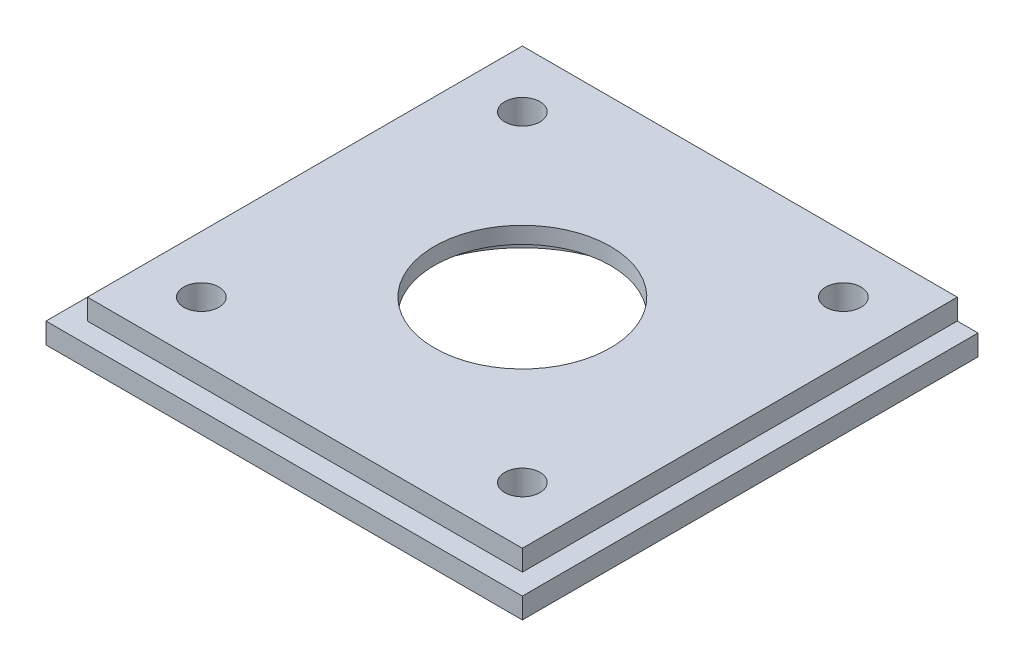
ISO-10303-21;
HEADER;
FILE_DESCRIPTION(('STEP AP214'),'2;1');
FILE_NAME('part.step','',(''),(''),'','','');
FILE_SCHEMA(('AUTOMOTIVE_DESIGN { 1 0 10303 214 1 1 1 1 }'));
ENDSEC;
DATA;
#1=APPLICATION_CONTEXT('core data for automotive mechanical design processes');
#2=APPLICATION_PROTOCOL_DEFINITION('international standard','automotive_design',2000,#1);
#3=PRODUCT_CONTEXT('',#1,'mechanical');
#4=PRODUCT('Part','Part','',(#3));
#5=PRODUCT_RELATED_PRODUCT_CATEGORY('part','',(#4));
#6=PRODUCT_DEFINITION_FORMATION('','',#4);
#7=PRODUCT_DEFINITION_CONTEXT('part definition',#1,'design');
#8=PRODUCT_DEFINITION('design','',#6,#7);
#9=PRODUCT_DEFINITION_SHAPE('','',#8);
#10=(LENGTH_UNIT() NAMED_UNIT(*) SI_UNIT(.MILLI.,.METRE.));
#11=(NAMED_UNIT(*) PLANE_ANGLE_UNIT() SI_UNIT($,.RADIAN.));
#12=(NAMED_UNIT(*) SI_UNIT($,.STERADIAN.) SOLID_ANGLE_UNIT());
#13=UNCERTAINTY_MEASURE_WITH_UNIT(LENGTH_MEASURE(1.E-05),#10,'distance_accuracy_value','');
#14=(GEOMETRIC_REPRESENTATION_CONTEXT(3) GLOBAL_UNCERTAINTY_ASSIGNED_CONTEXT((#13)) GLOBAL_UNIT_ASSIGNED_CONTEXT((#10,
#11,#12)) REPRESENTATION_CONTEXT('',''));
#15=CARTESIAN_POINT('',(0.,0.,0.));
#16=DIRECTION('',(0.,0.,1.));
#17=DIRECTION('',(1.,0.,0.));
#18=AXIS2_PLACEMENT_3D('',#15,#16,#17);
#19=CARTESIAN_POINT('',(-21.,4.,21.));
#20=DIRECTION('',(1.,0.,0.));
#21=DIRECTION('',(0.,0.,-1.));
#22=AXIS2_PLACEMENT_3D('',#19,#20,#21);
#23=PLANE('',#22);
#24=DIRECTION('',(0.,0.,1.));
#25=VECTOR('',#24,1.);
#26=CARTESIAN_POINT('',(-21.,2.,-21.));
#27=LINE('',#26,#25);
#28=CARTESIAN_POINT('',(-21.,2.,-21.));
#29=VERTEX_POINT('',#28);
#30=CARTESIAN_POINT('',(-21.,2.,21.));
#31=VERTEX_POINT('',#30);
#32=EDGE_CURVE('E52',#29,#31,#27,.T.);
#33=ORIENTED_EDGE('',*,*,#32,.T.);
#34=DIRECTION('',(0.,-1.,0.));
#35=VECTOR('',#34,1.);
#36=CARTESIAN_POINT('',(-21.,4.,21.));
#37=LINE('',#36,#35);
#38=CARTESIAN_POINT('',(-21.,4.,21.));
#39=VERTEX_POINT('',#38);
#40=EDGE_CURVE('E11',#39,#31,#37,.T.);
#41=ORIENTED_EDGE('',*,*,#40,.F.);
#42=DIRECTION('',(0.,0.,1.));
#43=VECTOR('',#42,1.);
#44=CARTESIAN_POINT('',(-21.,4.,21.));
#45=LINE('',#44,#43);
#46=CARTESIAN_POINT('',(-21.,4.,-21.));
#47=VERTEX_POINT('',#46);
#48=EDGE_CURVE('E187',#47,#39,#45,.T.);
#49=ORIENTED_EDGE('',*,*,#48,.F.);
#50=DIRECTION('',(0.,-1.,0.));
#51=VECTOR('',#50,1.);
#52=CARTESIAN_POINT('',(-21.,4.,-21.));
#53=LINE('',#52,#51);
#54=EDGE_CURVE('E196',#47,#29,#53,.T.);
#55=ORIENTED_EDGE('',*,*,#54,.T.);
#56=EDGE_LOOP('',(#33,#41,#49,#55));
#57=FACE_BOUND('',#56,.T.);
#58=ADVANCED_FACE('F37',(#57),#23,.F.);
#59=CARTESIAN_POINT('',(-21.,4.,21.));
#60=DIRECTION('',(0.,0.,-1.));
#61=DIRECTION('',(-1.,0.,0.));
#62=AXIS2_PLACEMENT_3D('',#59,#60,#61);
#63=PLANE('',#62);
#64=DIRECTION('',(1.,0.,0.));
#65=VECTOR('',#64,1.);
#66=CARTESIAN_POINT('',(-21.,2.,21.));
#67=LINE('',#66,#65);
#68=CARTESIAN_POINT('',(21.,2.,21.));
#69=VERTEX_POINT('',#68);
#70=EDGE_CURVE('E58',#31,#69,#67,.T.);
#71=ORIENTED_EDGE('',*,*,#70,.T.);
#72=DIRECTION('',(0.,-1.,0.));
#73=VECTOR('',#72,1.);
#74=CARTESIAN_POINT('',(21.,4.,21.));
#75=LINE('',#74,#73);
#76=CARTESIAN_POINT('',(21.,4.,21.));
#77=VERTEX_POINT('',#76);
#78=EDGE_CURVE('E45',#77,#69,#75,.T.);
#79=ORIENTED_EDGE('',*,*,#78,.F.);
#80=DIRECTION('',(1.,0.,0.));
#81=VECTOR('',#80,1.);
#82=CARTESIAN_POINT('',(-21.,4.,21.));
#83=LINE('',#82,#81);
#84=EDGE_CURVE('E190',#39,#77,#83,.T.);
#85=ORIENTED_EDGE('',*,*,#84,.F.);
#86=ORIENTED_EDGE('',*,*,#40,.T.);
#87=EDGE_LOOP('',(#71,#79,#85,#86));
#88=FACE_BOUND('',#87,.T.);
#89=ADVANCED_FACE('F242',(#88),#63,.F.);
#90=CARTESIAN_POINT('',(21.,4.,21.));
#91=DIRECTION('',(-1.,0.,0.));
#92=DIRECTION('',(0.,0.,1.));
#93=AXIS2_PLACEMENT_3D('',#90,#91,#92);
#94=PLANE('',#93);
#95=DIRECTION('',(0.,0.,-1.));
#96=VECTOR('',#95,1.);
#97=CARTESIAN_POINT('',(21.,2.,21.));
#98=LINE('',#97,#96);
#99=CARTESIAN_POINT('',(21.,2.,-21.));
#100=VERTEX_POINT('',#99);
#101=EDGE_CURVE('E131',#69,#100,#98,.T.);
#102=ORIENTED_EDGE('',*,*,#101,.T.);
#103=DIRECTION('',(0.,-1.,0.));
#104=VECTOR('',#103,1.);
#105=CARTESIAN_POINT('',(21.,4.,-21.));
#106=LINE('',#105,#104);
#107=CARTESIAN_POINT('',(21.,4.,-21.));
#108=VERTEX_POINT('',#107);
#109=EDGE_CURVE('E130',#108,#100,#106,.T.);
#110=ORIENTED_EDGE('',*,*,#109,.F.);
#111=DIRECTION('',(0.,0.,-1.));
#112=VECTOR('',#111,1.);
#113=CARTESIAN_POINT('',(21.,4.,21.));
#114=LINE('',#113,#112);
#115=EDGE_CURVE('E192',#77,#108,#114,.T.);
#116=ORIENTED_EDGE('',*,*,#115,.F.);
#117=ORIENTED_EDGE('',*,*,#78,.T.);
#118=EDGE_LOOP('',(#102,#110,#116,#117));
#119=FACE_BOUND('',#118,.T.);
#120=ADVANCED_FACE('F202',(#119),#94,.F.);
#121=CARTESIAN_POINT('',(0.,4.,0.));
#122=DIRECTION('',(0.,-1.,0.));
#123=DIRECTION('',(0.,0.,-1.));
#124=AXIS2_PLACEMENT_3D('',#121,#122,#123);
#125=CYLINDRICAL_SURFACE('',#124,8.5);
#126=CARTESIAN_POINT('',(0.,4.,0.));
#127=DIRECTION('',(0.,1.,0.));
#128=DIRECTION('',(0.,0.,1.));
#129=AXIS2_PLACEMENT_3D('',#126,#127,#128);
#130=CIRCLE('',#129,8.5);
#131=CARTESIAN_POINT('',(0.,4.,8.5));
#132=VERTEX_POINT('',#131);
#133=EDGE_CURVE('E159',#132,#132,#130,.T.);
#134=ORIENTED_EDGE('',*,*,#133,.T.);
#135=EDGE_LOOP('',(#134));
#136=FACE_BOUND('',#135,.T.);
#137=CARTESIAN_POINT('',(0.,2.4,0.));
#138=DIRECTION('',(0.,-1.,0.));
#139=DIRECTION('',(0.,0.,-1.));
#140=AXIS2_PLACEMENT_3D('',#137,#138,#139);
#141=CIRCLE('',#140,8.5);
#142=CARTESIAN_POINT('',(0.,2.4,-8.5));
#143=VERTEX_POINT('',#142);
#144=EDGE_CURVE('E40',#143,#143,#141,.T.);
#145=ORIENTED_EDGE('',*,*,#144,.T.);
#146=EDGE_LOOP('',(#145));
#147=FACE_BOUND('',#146,.T.);
#148=ADVANCED_FACE('F249',(#136,#147),#125,.F.);
#149=CARTESIAN_POINT('',(0.,4.,0.));
#150=DIRECTION('',(0.,-1.,0.));
#151=DIRECTION('',(0.,0.,-1.));
#152=AXIS2_PLACEMENT_3D('',#149,#150,#151);
#153=PLANE('',#152);
#154=ORIENTED_EDGE('',*,*,#48,.T.);
#155=ORIENTED_EDGE('',*,*,#84,.T.);
#156=ORIENTED_EDGE('',*,*,#115,.T.);
#157=DIRECTION('',(-1.,0.,0.));
#158=VECTOR('',#157,1.);
#159=CARTESIAN_POINT('',(-21.,4.,-21.));
#160=LINE('',#159,#158);
#161=EDGE_CURVE('E194',#108,#47,#160,.T.);
#162=ORIENTED_EDGE('',*,*,#161,.T.);
#163=EDGE_LOOP('',(#154,#155,#156,#162));
#164=FACE_BOUND('',#163,.T.);
#165=CARTESIAN_POINT('',(-15.5,4.,-15.5));
#166=DIRECTION('',(0.,1.,0.));
#167=DIRECTION('',(0.,0.,1.));
#168=AXIS2_PLACEMENT_3D('',#165,#166,#167);
#169=CIRCLE('',#168,1.7);
#170=CARTESIAN_POINT('',(-15.5,4.,-13.8));
#171=VERTEX_POINT('',#170);
#172=EDGE_CURVE('E181',#171,#171,#169,.T.);
#173=ORIENTED_EDGE('',*,*,#172,.F.);
#174=EDGE_LOOP('',(#173));
#175=FACE_BOUND('',#174,.T.);
#176=CARTESIAN_POINT('',(15.5,4.,-15.5));
#177=DIRECTION('',(0.,1.,0.));
#178=DIRECTION('',(0.,0.,1.));
#179=AXIS2_PLACEMENT_3D('',#176,#177,#178);
#180=CIRCLE('',#179,1.69999999999999);
#181=CARTESIAN_POINT('',(15.5,4.,-13.8));
#182=VERTEX_POINT('',#181);
#183=EDGE_CURVE('E175',#182,#182,#180,.T.);
#184=ORIENTED_EDGE('',*,*,#183,.F.);
#185=EDGE_LOOP('',(#184));
#186=FACE_BOUND('',#185,.T.);
#187=CARTESIAN_POINT('',(-15.5,4.,15.5));
#188=DIRECTION('',(0.,1.,0.));
#189=DIRECTION('',(0.,0.,1.));
#190=AXIS2_PLACEMENT_3D('',#187,#188,#189);
#191=CIRCLE('',#190,1.7);
#192=CARTESIAN_POINT('',(-15.5,4.,17.2));
#193=VERTEX_POINT('',#192);
#194=EDGE_CURVE('E169',#193,#193,#191,.T.);
#195=ORIENTED_EDGE('',*,*,#194,.F.);
#196=EDGE_LOOP('',(#195));
#197=FACE_BOUND('',#196,.T.);
#198=CARTESIAN_POINT('',(15.5,4.,15.5));
#199=DIRECTION('',(0.,1.,0.));
#200=DIRECTION('',(0.,0.,1.));
#201=AXIS2_PLACEMENT_3D('',#198,#199,#200);
#202=CIRCLE('',#201,1.7);
#203=CARTESIAN_POINT('',(15.5,4.,17.2));
#204=VERTEX_POINT('',#203);
#205=EDGE_CURVE('E163',#204,#204,#202,.T.);
#206=ORIENTED_EDGE('',*,*,#205,.F.);
#207=EDGE_LOOP('',(#206));
#208=FACE_BOUND('',#207,.T.);
#209=ORIENTED_EDGE('',*,*,#133,.F.);
#210=EDGE_LOOP('',(#209));
#211=FACE_BOUND('',#210,.T.);
#212=ADVANCED_FACE('F218',(#164,#175,#186,#197,#208,#211),#153,.F.);
#213=CARTESIAN_POINT('',(0.,0.,0.));
#214=DIRECTION('',(0.,-1.,0.));
#215=DIRECTION('',(0.,0.,-1.));
#216=AXIS2_PLACEMENT_3D('',#213,#214,#215);
#217=PLANE('',#216);
#218=CARTESIAN_POINT('',(0.,0.,0.));
#219=DIRECTION('',(0.,-1.,0.));
#220=DIRECTION('',(0.,0.,-1.));
#221=AXIS2_PLACEMENT_3D('',#218,#219,#220);
#222=CIRCLE('',#221,11.5);
#223=CARTESIAN_POINT('',(0.,0.,-11.5));
#224=VERTEX_POINT('',#223);
#225=EDGE_CURVE('E150',#224,#224,#222,.T.);
#226=ORIENTED_EDGE('',*,*,#225,.F.);
#227=EDGE_LOOP('',(#226));
#228=FACE_BOUND('',#227,.T.);
#229=CARTESIAN_POINT('',(15.5,0.,15.5));
#230=DIRECTION('',(0.,1.,0.));
#231=DIRECTION('',(0.,0.,1.));
#232=AXIS2_PLACEMENT_3D('',#229,#230,#231);
#233=CIRCLE('',#232,1.7);
#234=CARTESIAN_POINT('',(15.5,0.,17.2));
#235=VERTEX_POINT('',#234);
#236=EDGE_CURVE('E162',#235,#235,#233,.T.);
#237=ORIENTED_EDGE('',*,*,#236,.T.);
#238=EDGE_LOOP('',(#237));
#239=FACE_BOUND('',#238,.T.);
#240=CARTESIAN_POINT('',(15.5,0.,-15.5));
#241=DIRECTION('',(0.,1.,0.));
#242=DIRECTION('',(0.,0.,1.));
#243=AXIS2_PLACEMENT_3D('',#240,#241,#242);
#244=CIRCLE('',#243,1.69999999999999);
#245=CARTESIAN_POINT('',(15.5,0.,-13.8));
#246=VERTEX_POINT('',#245);
#247=EDGE_CURVE('E172',#246,#246,#244,.T.);
#248=ORIENTED_EDGE('',*,*,#247,.T.);
#249=EDGE_LOOP('',(#248));
#250=FACE_BOUND('',#249,.T.);
#251=DIRECTION('',(0.,0.,-1.));
#252=VECTOR('',#251,1.);
#253=CARTESIAN_POINT('',(-23.,0.,23.));
#254=LINE('',#253,#252);
#255=CARTESIAN_POINT('',(-23.,0.,23.));
#256=VERTEX_POINT('',#255);
#257=CARTESIAN_POINT('',(-23.,0.,-21.));
#258=VERTEX_POINT('',#257);
#259=EDGE_CURVE('E143',#256,#258,#254,.T.);
#260=ORIENTED_EDGE('',*,*,#259,.T.);
#261=DIRECTION('',(-1.,0.,0.));
#262=VECTOR('',#261,1.);
#263=CARTESIAN_POINT('',(-21.,0.,-21.));
#264=LINE('',#263,#262);
#265=CARTESIAN_POINT('',(23.,0.,-21.));
#266=VERTEX_POINT('',#265);
#267=EDGE_CURVE('E184',#266,#258,#264,.T.);
#268=ORIENTED_EDGE('',*,*,#267,.F.);
#269=DIRECTION('',(0.,0.,1.));
#270=VECTOR('',#269,1.);
#271=CARTESIAN_POINT('',(23.,0.,-21.));
#272=LINE('',#271,#270);
#273=CARTESIAN_POINT('',(23.,0.,23.));
#274=VERTEX_POINT('',#273);
#275=EDGE_CURVE('E109',#266,#274,#272,.T.);
#276=ORIENTED_EDGE('',*,*,#275,.T.);
#277=DIRECTION('',(-1.,0.,0.));
#278=VECTOR('',#277,1.);
#279=CARTESIAN_POINT('',(23.,0.,23.));
#280=LINE('',#279,#278);
#281=EDGE_CURVE('E140',#274,#256,#280,.T.);
#282=ORIENTED_EDGE('',*,*,#281,.T.);
#283=EDGE_LOOP('',(#260,#268,#276,#282));
#284=FACE_BOUND('',#283,.T.);
#285=CARTESIAN_POINT('',(-15.5,0.,-15.5));
#286=DIRECTION('',(0.,1.,0.));
#287=DIRECTION('',(0.,0.,1.));
#288=AXIS2_PLACEMENT_3D('',#285,#286,#287);
#289=CIRCLE('',#288,1.7);
#290=CARTESIAN_POINT('',(-15.5,0.,-13.8));
#291=VERTEX_POINT('',#290);
#292=EDGE_CURVE('E178',#291,#291,#289,.T.);
#293=ORIENTED_EDGE('',*,*,#292,.T.);
#294=EDGE_LOOP('',(#293));
#295=FACE_BOUND('',#294,.T.);
#296=CARTESIAN_POINT('',(-15.5,0.,15.5));
#297=DIRECTION('',(0.,1.,0.));
#298=DIRECTION('',(0.,0.,1.));
#299=AXIS2_PLACEMENT_3D('',#296,#297,#298);
#300=CIRCLE('',#299,1.7);
#301=CARTESIAN_POINT('',(-15.5,0.,17.2));
#302=VERTEX_POINT('',#301);
#303=EDGE_CURVE('E166',#302,#302,#300,.T.);
#304=ORIENTED_EDGE('',*,*,#303,.T.);
#305=EDGE_LOOP('',(#304));
#306=FACE_BOUND('',#305,.T.);
#307=ADVANCED_FACE('F215',(#228,#239,#250,#284,#295,#306),#217,.T.);
#308=CARTESIAN_POINT('',(-21.,4.,-21.));
#309=DIRECTION('',(0.,0.,1.));
#310=DIRECTION('',(1.,0.,0.));
#311=AXIS2_PLACEMENT_3D('',#308,#309,#310);
#312=PLANE('',#311);
#313=ORIENTED_EDGE('',*,*,#267,.T.);
#314=DIRECTION('',(0.,-1.,0.));
#315=VECTOR('',#314,1.);
#316=CARTESIAN_POINT('',(-23.,2.,-21.));
#317=LINE('',#316,#315);
#318=CARTESIAN_POINT('',(-23.,2.,-21.));
#319=VERTEX_POINT('',#318);
#320=EDGE_CURVE('E147',#319,#258,#317,.T.);
#321=ORIENTED_EDGE('',*,*,#320,.F.);
#322=DIRECTION('',(1.,0.,0.));
#323=VECTOR('',#322,1.);
#324=CARTESIAN_POINT('',(-23.,2.,-21.));
#325=LINE('',#324,#323);
#326=EDGE_CURVE('E146',#319,#29,#325,.T.);
#327=ORIENTED_EDGE('',*,*,#326,.T.);
#328=ORIENTED_EDGE('',*,*,#54,.F.);
#329=ORIENTED_EDGE('',*,*,#161,.F.);
#330=ORIENTED_EDGE('',*,*,#109,.T.);
#331=DIRECTION('',(1.,0.,0.));
#332=VECTOR('',#331,1.);
#333=CARTESIAN_POINT('',(21.,2.,-21.));
#334=LINE('',#333,#332);
#335=CARTESIAN_POINT('',(23.,2.,-21.));
#336=VERTEX_POINT('',#335);
#337=EDGE_CURVE('E121',#100,#336,#334,.T.);
#338=ORIENTED_EDGE('',*,*,#337,.T.);
#339=DIRECTION('',(0.,-1.,0.));
#340=VECTOR('',#339,1.);
#341=CARTESIAN_POINT('',(23.,2.,-21.));
#342=LINE('',#341,#340);
#343=EDGE_CURVE('E104',#336,#266,#342,.T.);
#344=ORIENTED_EDGE('',*,*,#343,.T.);
#345=EDGE_LOOP('',(#313,#321,#327,#328,#329,#330,#338,#344));
#346=FACE_BOUND('',#345,.T.);
#347=ADVANCED_FACE('F127',(#346),#312,.F.);
#348=CARTESIAN_POINT('',(-15.5,4.,-15.5));
#349=DIRECTION('',(0.,-1.,0.));
#350=DIRECTION('',(0.,0.,-1.));
#351=AXIS2_PLACEMENT_3D('',#348,#349,#350);
#352=CYLINDRICAL_SURFACE('',#351,1.7);
#353=ORIENTED_EDGE('',*,*,#172,.T.);
#354=EDGE_LOOP('',(#353));
#355=FACE_BOUND('',#354,.T.);
#356=ORIENTED_EDGE('',*,*,#292,.F.);
#357=EDGE_LOOP('',(#356));
#358=FACE_BOUND('',#357,.T.);
#359=ADVANCED_FACE('F238',(#355,#358),#352,.F.);
#360=CARTESIAN_POINT('',(15.5,4.,-15.5));
#361=DIRECTION('',(0.,-1.,0.));
#362=DIRECTION('',(0.,0.,-1.));
#363=AXIS2_PLACEMENT_3D('',#360,#361,#362);
#364=CYLINDRICAL_SURFACE('',#363,1.69999999999999);
#365=ORIENTED_EDGE('',*,*,#183,.T.);
#366=EDGE_LOOP('',(#365));
#367=FACE_BOUND('',#366,.T.);
#368=ORIENTED_EDGE('',*,*,#247,.F.);
#369=EDGE_LOOP('',(#368));
#370=FACE_BOUND('',#369,.T.);
#371=ADVANCED_FACE('F228',(#367,#370),#364,.F.);
#372=CARTESIAN_POINT('',(-15.5,4.,15.5));
#373=DIRECTION('',(0.,-1.,0.));
#374=DIRECTION('',(0.,0.,-1.));
#375=AXIS2_PLACEMENT_3D('',#372,#373,#374);
#376=CYLINDRICAL_SURFACE('',#375,1.7);
#377=ORIENTED_EDGE('',*,*,#194,.T.);
#378=EDGE_LOOP('',(#377));
#379=FACE_BOUND('',#378,.T.);
#380=ORIENTED_EDGE('',*,*,#303,.F.);
#381=EDGE_LOOP('',(#380));
#382=FACE_BOUND('',#381,.T.);
#383=ADVANCED_FACE('F225',(#379,#382),#376,.F.);
#384=CARTESIAN_POINT('',(15.5,4.,15.5));
#385=DIRECTION('',(0.,-1.,0.));
#386=DIRECTION('',(0.,0.,-1.));
#387=AXIS2_PLACEMENT_3D('',#384,#385,#386);
#388=CYLINDRICAL_SURFACE('',#387,1.7);
#389=ORIENTED_EDGE('',*,*,#205,.T.);
#390=EDGE_LOOP('',(#389));
#391=FACE_BOUND('',#390,.T.);
#392=ORIENTED_EDGE('',*,*,#236,.F.);
#393=EDGE_LOOP('',(#392));
#394=FACE_BOUND('',#393,.T.);
#395=ADVANCED_FACE('F227',(#391,#394),#388,.F.);
#396=CARTESIAN_POINT('',(0.,2.4,0.));
#397=DIRECTION('',(0.,-1.,0.));
#398=DIRECTION('',(0.,0.,-1.));
#399=AXIS2_PLACEMENT_3D('',#396,#397,#398);
#400=CYLINDRICAL_SURFACE('',#399,11.5);
#401=CARTESIAN_POINT('',(0.,2.4,0.));
#402=DIRECTION('',(0.,-1.,0.));
#403=DIRECTION('',(0.,0.,-1.));
#404=AXIS2_PLACEMENT_3D('',#401,#402,#403);
#405=CIRCLE('',#404,11.5);
#406=CARTESIAN_POINT('',(0.,2.4,-11.5));
#407=VERTEX_POINT('',#406);
#408=EDGE_CURVE('E154',#407,#407,#405,.T.);
#409=ORIENTED_EDGE('',*,*,#408,.F.);
#410=EDGE_LOOP('',(#409));
#411=FACE_BOUND('',#410,.T.);
#412=ORIENTED_EDGE('',*,*,#225,.T.);
#413=EDGE_LOOP('',(#412));
#414=FACE_BOUND('',#413,.T.);
#415=ADVANCED_FACE('F235',(#411,#414),#400,.F.);
#416=CARTESIAN_POINT('',(0.,2.4,0.));
#417=DIRECTION('',(0.,-1.,0.));
#418=DIRECTION('',(0.,0.,-1.));
#419=AXIS2_PLACEMENT_3D('',#416,#417,#418);
#420=PLANE('',#419);
#421=ORIENTED_EDGE('',*,*,#144,.F.);
#422=EDGE_LOOP('',(#421));
#423=FACE_BOUND('',#422,.T.);
#424=ORIENTED_EDGE('',*,*,#408,.T.);
#425=EDGE_LOOP('',(#424));
#426=FACE_BOUND('',#425,.T.);
#427=ADVANCED_FACE('F279',(#423,#426),#420,.T.);
#428=CARTESIAN_POINT('',(-23.,2.,23.));
#429=DIRECTION('',(-1.,0.,0.));
#430=DIRECTION('',(0.,0.,1.));
#431=AXIS2_PLACEMENT_3D('',#428,#429,#430);
#432=PLANE('',#431);
#433=ORIENTED_EDGE('',*,*,#259,.F.);
#434=DIRECTION('',(0.,-1.,0.));
#435=VECTOR('',#434,1.);
#436=CARTESIAN_POINT('',(-23.,2.,23.));
#437=LINE('',#436,#435);
#438=CARTESIAN_POINT('',(-23.,2.,23.));
#439=VERTEX_POINT('',#438);
#440=EDGE_CURVE('E151',#439,#256,#437,.T.);
#441=ORIENTED_EDGE('',*,*,#440,.F.);
#442=DIRECTION('',(0.,0.,-1.));
#443=VECTOR('',#442,1.);
#444=CARTESIAN_POINT('',(-23.,2.,23.));
#445=LINE('',#444,#443);
#446=EDGE_CURVE('E113',#439,#319,#445,.T.);
#447=ORIENTED_EDGE('',*,*,#446,.T.);
#448=ORIENTED_EDGE('',*,*,#320,.T.);
#449=EDGE_LOOP('',(#433,#441,#447,#448));
#450=FACE_BOUND('',#449,.T.);
#451=ADVANCED_FACE('F210',(#450),#432,.T.);
#452=CARTESIAN_POINT('',(23.,2.,23.));
#453=DIRECTION('',(0.,0.,1.));
#454=DIRECTION('',(1.,0.,0.));
#455=AXIS2_PLACEMENT_3D('',#452,#453,#454);
#456=PLANE('',#455);
#457=ORIENTED_EDGE('',*,*,#281,.F.);
#458=DIRECTION('',(0.,-1.,0.));
#459=VECTOR('',#458,1.);
#460=CARTESIAN_POINT('',(23.,2.,23.));
#461=LINE('',#460,#459);
#462=CARTESIAN_POINT('',(23.,2.,23.));
#463=VERTEX_POINT('',#462);
#464=EDGE_CURVE('E112',#463,#274,#461,.T.);
#465=ORIENTED_EDGE('',*,*,#464,.F.);
#466=DIRECTION('',(-1.,0.,0.));
#467=VECTOR('',#466,1.);
#468=CARTESIAN_POINT('',(23.,2.,23.));
#469=LINE('',#468,#467);
#470=EDGE_CURVE('E124',#463,#439,#469,.T.);
#471=ORIENTED_EDGE('',*,*,#470,.T.);
#472=ORIENTED_EDGE('',*,*,#440,.T.);
#473=EDGE_LOOP('',(#457,#465,#471,#472));
#474=FACE_BOUND('',#473,.T.);
#475=ADVANCED_FACE('F213',(#474),#456,.T.);
#476=CARTESIAN_POINT('',(23.,2.,-21.));
#477=DIRECTION('',(1.,0.,0.));
#478=DIRECTION('',(0.,0.,-1.));
#479=AXIS2_PLACEMENT_3D('',#476,#477,#478);
#480=PLANE('',#479);
#481=ORIENTED_EDGE('',*,*,#275,.F.);
#482=ORIENTED_EDGE('',*,*,#343,.F.);
#483=DIRECTION('',(0.,0.,1.));
#484=VECTOR('',#483,1.);
#485=CARTESIAN_POINT('',(23.,2.,-21.));
#486=LINE('',#485,#484);
#487=EDGE_CURVE('E107',#336,#463,#486,.T.);
#488=ORIENTED_EDGE('',*,*,#487,.T.);
#489=ORIENTED_EDGE('',*,*,#464,.T.);
#490=EDGE_LOOP('',(#481,#482,#488,#489));
#491=FACE_BOUND('',#490,.T.);
#492=ADVANCED_FACE('F106',(#491),#480,.T.);
#493=CARTESIAN_POINT('',(0.,2.,0.));
#494=DIRECTION('',(0.,-1.,0.));
#495=DIRECTION('',(0.,0.,-1.));
#496=AXIS2_PLACEMENT_3D('',#493,#494,#495);
#497=PLANE('',#496);
#498=ORIENTED_EDGE('',*,*,#326,.F.);
#499=ORIENTED_EDGE('',*,*,#446,.F.);
#500=ORIENTED_EDGE('',*,*,#470,.F.);
#501=ORIENTED_EDGE('',*,*,#487,.F.);
#502=ORIENTED_EDGE('',*,*,#337,.F.);
#503=ORIENTED_EDGE('',*,*,#101,.F.);
#504=ORIENTED_EDGE('',*,*,#70,.F.);
#505=ORIENTED_EDGE('',*,*,#32,.F.);
#506=EDGE_LOOP('',(#498,#499,#500,#501,#502,#503,#504,#505));
#507=FACE_BOUND('',#506,.T.);
#508=ADVANCED_FACE('F119',(#507),#497,.F.);
#509=CLOSED_SHELL('',(#58,#89,#120,#148,#212,#307,#347,#359,#371,#383,#395,#415,#427,#451,#475,
#492,#508));
#510=MANIFOLD_SOLID_BREP('B2',#509);
#511=ADVANCED_BREP_SHAPE_REPRESENTATION('',(#18,#510),#14);
#512=SHAPE_DEFINITION_REPRESENTATION(#9,#511);
ENDSEC;
END-ISO-10303-21;
